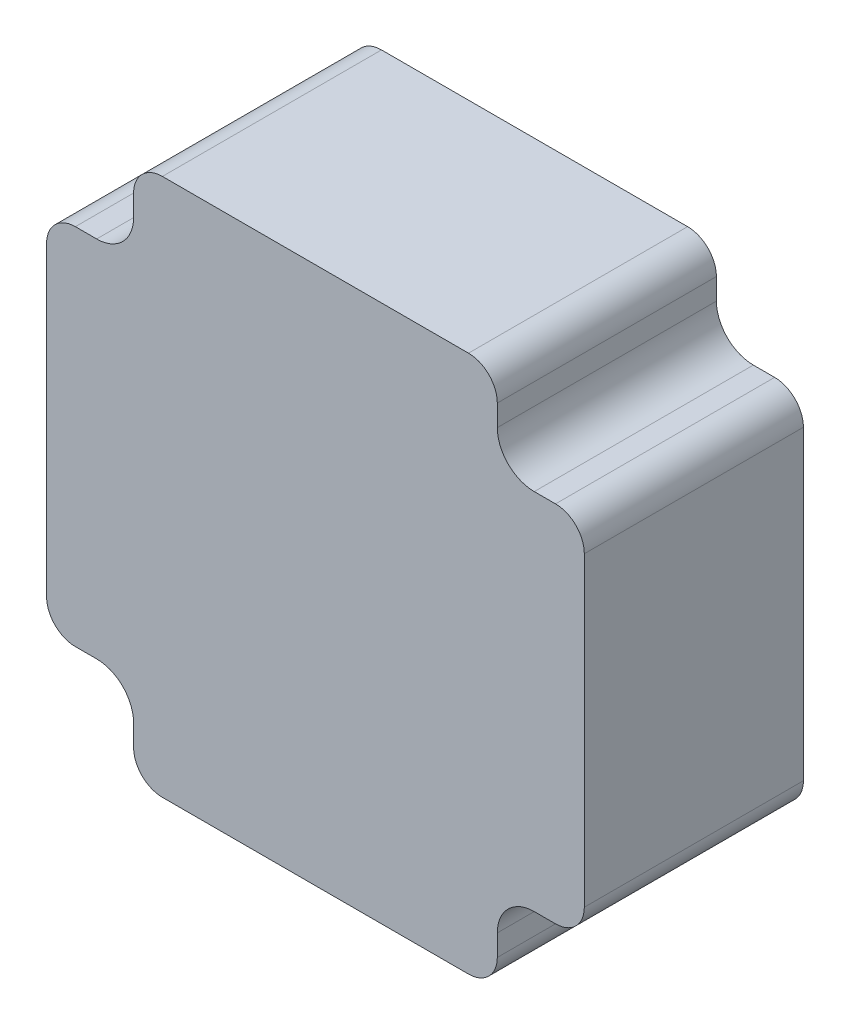
ISO-10303-21;
HEADER;
FILE_DESCRIPTION(('STEP AP214'),'2;1');
FILE_NAME('part.step','',(''),(''),'','','');
FILE_SCHEMA(('AUTOMOTIVE_DESIGN { 1 0 10303 214 1 1 1 1 }'));
ENDSEC;
DATA;
#1=APPLICATION_CONTEXT('core data for automotive mechanical design processes');
#2=APPLICATION_PROTOCOL_DEFINITION('international standard','automotive_design',2000,#1);
#3=PRODUCT_CONTEXT('',#1,'mechanical');
#4=PRODUCT('Part','Part','',(#3));
#5=PRODUCT_RELATED_PRODUCT_CATEGORY('part','',(#4));
#6=PRODUCT_DEFINITION_FORMATION('','',#4);
#7=PRODUCT_DEFINITION_CONTEXT('part definition',#1,'design');
#8=PRODUCT_DEFINITION('design','',#6,#7);
#9=PRODUCT_DEFINITION_SHAPE('','',#8);
#10=(LENGTH_UNIT() NAMED_UNIT(*) SI_UNIT(.MILLI.,.METRE.));
#11=(NAMED_UNIT(*) PLANE_ANGLE_UNIT() SI_UNIT($,.RADIAN.));
#12=(NAMED_UNIT(*) SI_UNIT($,.STERADIAN.) SOLID_ANGLE_UNIT());
#13=UNCERTAINTY_MEASURE_WITH_UNIT(LENGTH_MEASURE(1.E-05),#10,'distance_accuracy_value','');
#14=(GEOMETRIC_REPRESENTATION_CONTEXT(3) GLOBAL_UNCERTAINTY_ASSIGNED_CONTEXT((#13)) GLOBAL_UNIT_ASSIGNED_CONTEXT((#10,
#11,#12)) REPRESENTATION_CONTEXT('',''));
#15=CARTESIAN_POINT('',(0.,0.,0.));
#16=DIRECTION('',(0.,0.,1.));
#17=DIRECTION('',(1.,0.,0.));
#18=AXIS2_PLACEMENT_3D('',#15,#16,#17);
#19=CARTESIAN_POINT('',(38.3514690308085,-24.4516374316516,0.));
#20=DIRECTION('',(0.,0.,1.));
#21=DIRECTION('',(1.,0.,0.));
#22=AXIS2_PLACEMENT_3D('',#19,#20,#21);
#23=PLANE('',#22);
#24=CARTESIAN_POINT('',(38.3514690308085,-24.4516374316516,0.));
#25=DIRECTION('',(0.,0.,1.));
#26=DIRECTION('',(1.,0.,0.));
#27=AXIS2_PLACEMENT_3D('',#24,#25,#26);
#28=CIRCLE('',#27,4.6);
#29=CARTESIAN_POINT('',(38.3514690308085,-29.0516374316517,0.));
#30=VERTEX_POINT('',#29);
#31=CARTESIAN_POINT('',(42.9514690308084,-24.4516374316516,0.));
#32=VERTEX_POINT('',#31);
#33=EDGE_CURVE('E334',#30,#32,#28,.T.);
#34=ORIENTED_EDGE('',*,*,#33,.F.);
#35=DIRECTION('',(1.,0.,0.));
#36=VECTOR('',#35,1.);
#37=CARTESIAN_POINT('',(34.9514690308083,-29.0516374316517,0.));
#38=LINE('',#37,#36);
#39=CARTESIAN_POINT('',(34.9514690308083,-29.0516374316517,0.));
#40=VERTEX_POINT('',#39);
#41=EDGE_CURVE('E26',#40,#30,#38,.T.);
#42=ORIENTED_EDGE('',*,*,#41,.F.);
#43=CARTESIAN_POINT('',(34.9514690308075,-34.9516374316516,0.));
#44=DIRECTION('',(0.,0.,-1.));
#45=DIRECTION('',(1.,0.,0.));
#46=AXIS2_PLACEMENT_3D('',#43,#44,#45);
#47=CIRCLE('',#46,5.89999999999974);
#48=CARTESIAN_POINT('',(29.0514690308077,-34.9516374316516,0.));
#49=VERTEX_POINT('',#48);
#50=EDGE_CURVE('E128',#49,#40,#47,.T.);
#51=ORIENTED_EDGE('',*,*,#50,.F.);
#52=DIRECTION('',(0.,1.,0.));
#53=VECTOR('',#52,1.);
#54=CARTESIAN_POINT('',(29.0514690308079,-34.9516374316516,0.));
#55=LINE('',#54,#53);
#56=CARTESIAN_POINT('',(29.0514690308079,-38.3516374316512,0.));
#57=VERTEX_POINT('',#56);
#58=EDGE_CURVE('E131',#57,#49,#55,.T.);
#59=ORIENTED_EDGE('',*,*,#58,.F.);
#60=CARTESIAN_POINT('',(24.4514690308079,-38.3516374316512,0.));
#61=DIRECTION('',(0.,0.,1.));
#62=DIRECTION('',(1.,0.,0.));
#63=AXIS2_PLACEMENT_3D('',#60,#61,#62);
#64=CIRCLE('',#63,4.6);
#65=CARTESIAN_POINT('',(24.4514690308079,-42.9516374316512,0.));
#66=VERTEX_POINT('',#65);
#67=EDGE_CURVE('E167',#66,#57,#64,.T.);
#68=ORIENTED_EDGE('',*,*,#67,.F.);
#69=DIRECTION('',(1.,0.,0.));
#70=VECTOR('',#69,1.);
#71=CARTESIAN_POINT('',(24.4514690308079,-42.9516374316513,0.));
#72=LINE('',#71,#70);
#73=CARTESIAN_POINT('',(-24.4485309691918,-42.9516374316513,0.));
#74=VERTEX_POINT('',#73);
#75=EDGE_CURVE('E157',#74,#66,#72,.T.);
#76=ORIENTED_EDGE('',*,*,#75,.F.);
#77=CARTESIAN_POINT('',(-24.4485309691918,-38.3516374316514,0.));
#78=DIRECTION('',(0.,0.,1.));
#79=DIRECTION('',(1.,0.,0.));
#80=AXIS2_PLACEMENT_3D('',#77,#78,#79);
#81=CIRCLE('',#80,4.59999999999994);
#82=CARTESIAN_POINT('',(-29.0485309691917,-38.3516374316514,0.));
#83=VERTEX_POINT('',#82);
#84=EDGE_CURVE('E210',#83,#74,#81,.T.);
#85=ORIENTED_EDGE('',*,*,#84,.F.);
#86=DIRECTION('',(0.,-1.,0.));
#87=VECTOR('',#86,1.);
#88=CARTESIAN_POINT('',(-29.0485309691917,-34.9516374316513,0.));
#89=LINE('',#88,#87);
#90=CARTESIAN_POINT('',(-29.0485309691917,-34.9516374316513,0.));
#91=VERTEX_POINT('',#90);
#92=EDGE_CURVE('E201',#91,#83,#89,.T.);
#93=ORIENTED_EDGE('',*,*,#92,.F.);
#94=CARTESIAN_POINT('',(-34.9485309691912,-34.9516374316512,0.));
#95=DIRECTION('',(0.,0.,-1.));
#96=DIRECTION('',(1.,0.,0.));
#97=AXIS2_PLACEMENT_3D('',#94,#95,#96);
#98=CIRCLE('',#97,5.89999999999954);
#99=CARTESIAN_POINT('',(-34.9485309691912,-29.0516374316516,0.));
#100=VERTEX_POINT('',#99);
#101=EDGE_CURVE('E197',#100,#91,#98,.T.);
#102=ORIENTED_EDGE('',*,*,#101,.F.);
#103=DIRECTION('',(1.,0.,0.));
#104=VECTOR('',#103,1.);
#105=CARTESIAN_POINT('',(-34.9485309691912,-29.0516374316517,0.));
#106=LINE('',#105,#104);
#107=CARTESIAN_POINT('',(-38.3485309691922,-29.0516374316517,0.));
#108=VERTEX_POINT('',#107);
#109=EDGE_CURVE('E184',#108,#100,#106,.T.);
#110=ORIENTED_EDGE('',*,*,#109,.F.);
#111=CARTESIAN_POINT('',(-38.3485309691922,-24.4516374316518,0.));
#112=DIRECTION('',(0.,0.,1.));
#113=DIRECTION('',(1.,0.,0.));
#114=AXIS2_PLACEMENT_3D('',#111,#112,#113);
#115=CIRCLE('',#114,4.59999999999994);
#116=CARTESIAN_POINT('',(-42.9485309691921,-24.4516374316513,0.));
#117=VERTEX_POINT('',#116);
#118=EDGE_CURVE('E523',#117,#108,#115,.T.);
#119=ORIENTED_EDGE('',*,*,#118,.F.);
#120=DIRECTION('',(0.,-1.,0.));
#121=VECTOR('',#120,1.);
#122=CARTESIAN_POINT('',(-42.9485309691921,-0.0016374316514911,0.));
#123=LINE('',#122,#121);
#124=CARTESIAN_POINT('',(-42.9485309691921,24.4483625683486,0.));
#125=VERTEX_POINT('',#124);
#126=EDGE_CURVE('E418',#125,#117,#123,.T.);
#127=ORIENTED_EDGE('',*,*,#126,.F.);
#128=CARTESIAN_POINT('',(-38.3485309691922,24.4483625683486,0.));
#129=DIRECTION('',(0.,0.,1.));
#130=DIRECTION('',(1.,0.,0.));
#131=AXIS2_PLACEMENT_3D('',#128,#129,#130);
#132=CIRCLE('',#131,4.59999999999977);
#133=CARTESIAN_POINT('',(-38.3485309691932,29.0483625683484,0.));
#134=VERTEX_POINT('',#133);
#135=EDGE_CURVE('E385',#134,#125,#132,.T.);
#136=ORIENTED_EDGE('',*,*,#135,.F.);
#137=DIRECTION('',(-1.,0.,0.));
#138=VECTOR('',#137,1.);
#139=CARTESIAN_POINT('',(-34.9485309691932,29.0483625683483,0.));
#140=LINE('',#139,#138);
#141=CARTESIAN_POINT('',(-34.9485309691932,29.0483625683483,0.));
#142=VERTEX_POINT('',#141);
#143=EDGE_CURVE('E503',#142,#134,#140,.T.);
#144=ORIENTED_EDGE('',*,*,#143,.F.);
#145=CARTESIAN_POINT('',(-34.9485309691922,34.948362568348,0.));
#146=DIRECTION('',(0.,0.,-1.));
#147=DIRECTION('',(1.,0.,0.));
#148=AXIS2_PLACEMENT_3D('',#145,#146,#147);
#149=CIRCLE('',#148,5.89999999999974);
#150=CARTESIAN_POINT('',(-29.0485309691925,34.9483625683476,0.));
#151=VERTEX_POINT('',#150);
#152=EDGE_CURVE('E397',#151,#142,#149,.T.);
#153=ORIENTED_EDGE('',*,*,#152,.F.);
#154=DIRECTION('',(-2.44902137784916E-13,-1.,0.));
#155=VECTOR('',#154,1.);
#156=CARTESIAN_POINT('',(-29.0485309691925,34.9483625683476,0.));
#157=LINE('',#156,#155);
#158=CARTESIAN_POINT('',(-29.0485309691917,38.3483625683483,0.));
#159=VERTEX_POINT('',#158);
#160=EDGE_CURVE('E405',#159,#151,#157,.T.);
#161=ORIENTED_EDGE('',*,*,#160,.F.);
#162=CARTESIAN_POINT('',(-24.4485309691925,38.3483625683483,0.));
#163=DIRECTION('',(0.,0.,1.));
#164=DIRECTION('',(1.,0.,0.));
#165=AXIS2_PLACEMENT_3D('',#162,#163,#164);
#166=CIRCLE('',#165,4.59999999999963);
#167=CARTESIAN_POINT('',(-24.4485309691967,42.9483625683479,0.));
#168=VERTEX_POINT('',#167);
#169=EDGE_CURVE('E371',#168,#159,#166,.T.);
#170=ORIENTED_EDGE('',*,*,#169,.F.);
#171=DIRECTION('',(-1.,0.,0.));
#172=VECTOR('',#171,1.);
#173=CARTESIAN_POINT('',(0.00146903080405769,42.9483625683483,0.));
#174=LINE('',#173,#172);
#175=CARTESIAN_POINT('',(24.4514690308031,42.9483625683483,0.));
#176=VERTEX_POINT('',#175);
#177=EDGE_CURVE('E377',#176,#168,#174,.T.);
#178=ORIENTED_EDGE('',*,*,#177,.F.);
#179=CARTESIAN_POINT('',(24.4514690308031,38.3483625683475,0.));
#180=DIRECTION('',(0.,0.,1.));
#181=DIRECTION('',(1.,0.,0.));
#182=AXIS2_PLACEMENT_3D('',#179,#180,#181);
#183=CIRCLE('',#182,4.60000000000083);
#184=CARTESIAN_POINT('',(29.0514690308038,38.3483625683484,0.));
#185=VERTEX_POINT('',#184);
#186=EDGE_CURVE('E459',#185,#176,#183,.T.);
#187=ORIENTED_EDGE('',*,*,#186,.F.);
#188=DIRECTION('',(0.,1.,0.));
#189=VECTOR('',#188,1.);
#190=CARTESIAN_POINT('',(29.0514690308038,34.9483625683484,0.));
#191=LINE('',#190,#189);
#192=CARTESIAN_POINT('',(29.0514690308038,34.9483625683484,0.));
#193=VERTEX_POINT('',#192);
#194=EDGE_CURVE('E359',#193,#185,#191,.T.);
#195=ORIENTED_EDGE('',*,*,#194,.F.);
#196=CARTESIAN_POINT('',(34.9514690308034,34.9483625683478,0.));
#197=DIRECTION('',(0.,0.,-1.));
#198=DIRECTION('',(1.,0.,0.));
#199=AXIS2_PLACEMENT_3D('',#196,#197,#198);
#200=CIRCLE('',#199,5.89999999999954);
#201=CARTESIAN_POINT('',(34.9514690308034,29.0483625683483,0.));
#202=VERTEX_POINT('',#201);
#203=EDGE_CURVE('E414',#202,#193,#200,.T.);
#204=ORIENTED_EDGE('',*,*,#203,.F.);
#205=DIRECTION('',(-1.,0.,0.));
#206=VECTOR('',#205,1.);
#207=CARTESIAN_POINT('',(34.9514690308034,29.0483625683483,0.));
#208=LINE('',#207,#206);
#209=CARTESIAN_POINT('',(38.3514690308047,29.0483625683483,0.));
#210=VERTEX_POINT('',#209);
#211=EDGE_CURVE('E365',#210,#202,#208,.T.);
#212=ORIENTED_EDGE('',*,*,#211,.F.);
#213=CARTESIAN_POINT('',(38.3514690308076,24.4483625683479,0.));
#214=DIRECTION('',(0.,0.,1.));
#215=DIRECTION('',(1.,0.,0.));
#216=AXIS2_PLACEMENT_3D('',#213,#214,#215);
#217=CIRCLE('',#216,4.60000000000059);
#218=CARTESIAN_POINT('',(42.9514690308081,24.4483625683483,0.));
#219=VERTEX_POINT('',#218);
#220=EDGE_CURVE('E383',#219,#210,#217,.T.);
#221=ORIENTED_EDGE('',*,*,#220,.F.);
#222=DIRECTION('',(0.,1.,0.));
#223=VECTOR('',#222,1.);
#224=CARTESIAN_POINT('',(42.9514690308084,-0.0016374316514911,0.));
#225=LINE('',#224,#223);
#226=EDGE_CURVE('E401',#32,#219,#225,.T.);
#227=ORIENTED_EDGE('',*,*,#226,.F.);
#228=EDGE_LOOP('',(#34,#42,#51,#59,#68,#76,#85,#93,#102,#110,#119,#127,#136,#144,#153,#161,#170,
#178,#187,#195,#204,#212,#221,#227));
#229=FACE_BOUND('',#228,.T.);
#230=ADVANCED_FACE('F17',(#229),#23,.F.);
#231=CARTESIAN_POINT('',(38.3514690308085,-24.4516374316516,35.));
#232=DIRECTION('',(0.,0.,1.));
#233=DIRECTION('',(1.,0.,0.));
#234=AXIS2_PLACEMENT_3D('',#231,#232,#233);
#235=PLANE('',#234);
#236=CARTESIAN_POINT('',(38.3514690308085,-24.4516374316516,35.));
#237=DIRECTION('',(0.,0.,1.));
#238=DIRECTION('',(1.,0.,0.));
#239=AXIS2_PLACEMENT_3D('',#236,#237,#238);
#240=CIRCLE('',#239,4.6);
#241=CARTESIAN_POINT('',(38.3514690308085,-29.0516374316517,35.));
#242=VERTEX_POINT('',#241);
#243=CARTESIAN_POINT('',(42.9514690308084,-24.4516374316516,35.));
#244=VERTEX_POINT('',#243);
#245=EDGE_CURVE('E351',#242,#244,#240,.T.);
#246=ORIENTED_EDGE('',*,*,#245,.T.);
#247=DIRECTION('',(0.,1.,0.));
#248=VECTOR('',#247,1.);
#249=CARTESIAN_POINT('',(42.9514690308084,-0.0016374316514911,35.));
#250=LINE('',#249,#248);
#251=CARTESIAN_POINT('',(42.9514690308081,24.4483625683483,35.));
#252=VERTEX_POINT('',#251);
#253=EDGE_CURVE('E379',#244,#252,#250,.T.);
#254=ORIENTED_EDGE('',*,*,#253,.T.);
#255=CARTESIAN_POINT('',(38.3514690308076,24.4483625683479,35.));
#256=DIRECTION('',(0.,0.,1.));
#257=DIRECTION('',(1.,0.,0.));
#258=AXIS2_PLACEMENT_3D('',#255,#256,#257);
#259=CIRCLE('',#258,4.60000000000059);
#260=CARTESIAN_POINT('',(38.3514690308047,29.0483625683483,35.));
#261=VERTEX_POINT('',#260);
#262=EDGE_CURVE('E361',#252,#261,#259,.T.);
#263=ORIENTED_EDGE('',*,*,#262,.T.);
#264=DIRECTION('',(-1.,0.,0.));
#265=VECTOR('',#264,1.);
#266=CARTESIAN_POINT('',(34.9514690308034,29.0483625683483,35.));
#267=LINE('',#266,#265);
#268=CARTESIAN_POINT('',(34.9514690308034,29.0483625683483,35.));
#269=VERTEX_POINT('',#268);
#270=EDGE_CURVE('E355',#261,#269,#267,.T.);
#271=ORIENTED_EDGE('',*,*,#270,.T.);
#272=CARTESIAN_POINT('',(34.9514690308034,34.9483625683478,35.));
#273=DIRECTION('',(0.,0.,-1.));
#274=DIRECTION('',(1.,0.,0.));
#275=AXIS2_PLACEMENT_3D('',#272,#273,#274);
#276=CIRCLE('',#275,5.89999999999954);
#277=CARTESIAN_POINT('',(29.0514690308038,34.9483625683484,35.));
#278=VERTEX_POINT('',#277);
#279=EDGE_CURVE('E356',#269,#278,#276,.T.);
#280=ORIENTED_EDGE('',*,*,#279,.T.);
#281=DIRECTION('',(0.,1.,0.));
#282=VECTOR('',#281,1.);
#283=CARTESIAN_POINT('',(29.0514690308038,34.9483625683484,35.));
#284=LINE('',#283,#282);
#285=CARTESIAN_POINT('',(29.0514690308038,38.3483625683484,35.));
#286=VERTEX_POINT('',#285);
#287=EDGE_CURVE('E455',#278,#286,#284,.T.);
#288=ORIENTED_EDGE('',*,*,#287,.T.);
#289=CARTESIAN_POINT('',(24.4514690308031,38.3483625683475,35.));
#290=DIRECTION('',(0.,0.,1.));
#291=DIRECTION('',(1.,0.,0.));
#292=AXIS2_PLACEMENT_3D('',#289,#290,#291);
#293=CIRCLE('',#292,4.60000000000083);
#294=CARTESIAN_POINT('',(24.4514690308031,42.9483625683483,35.));
#295=VERTEX_POINT('',#294);
#296=EDGE_CURVE('E373',#286,#295,#293,.T.);
#297=ORIENTED_EDGE('',*,*,#296,.T.);
#298=DIRECTION('',(-1.,0.,0.));
#299=VECTOR('',#298,1.);
#300=CARTESIAN_POINT('',(0.00146903080405769,42.9483625683483,35.));
#301=LINE('',#300,#299);
#302=CARTESIAN_POINT('',(-24.4485309691967,42.9483625683479,35.));
#303=VERTEX_POINT('',#302);
#304=EDGE_CURVE('E472',#295,#303,#301,.T.);
#305=ORIENTED_EDGE('',*,*,#304,.T.);
#306=CARTESIAN_POINT('',(-24.4485309691925,38.3483625683483,35.));
#307=DIRECTION('',(0.,0.,1.));
#308=DIRECTION('',(1.,0.,0.));
#309=AXIS2_PLACEMENT_3D('',#306,#307,#308);
#310=CIRCLE('',#309,4.59999999999963);
#311=CARTESIAN_POINT('',(-29.0485309691917,38.3483625683483,35.));
#312=VERTEX_POINT('',#311);
#313=EDGE_CURVE('E370',#303,#312,#310,.T.);
#314=ORIENTED_EDGE('',*,*,#313,.T.);
#315=DIRECTION('',(-2.44902137784916E-13,-1.,0.));
#316=VECTOR('',#315,1.);
#317=CARTESIAN_POINT('',(-29.0485309691925,34.9483625683476,35.));
#318=LINE('',#317,#316);
#319=CARTESIAN_POINT('',(-29.0485309691925,34.9483625683476,35.));
#320=VERTEX_POINT('',#319);
#321=EDGE_CURVE('E393',#312,#320,#318,.T.);
#322=ORIENTED_EDGE('',*,*,#321,.T.);
#323=CARTESIAN_POINT('',(-34.9485309691922,34.948362568348,35.));
#324=DIRECTION('',(0.,0.,-1.));
#325=DIRECTION('',(1.,0.,0.));
#326=AXIS2_PLACEMENT_3D('',#323,#324,#325);
#327=CIRCLE('',#326,5.89999999999974);
#328=CARTESIAN_POINT('',(-34.9485309691932,29.0483625683483,35.));
#329=VERTEX_POINT('',#328);
#330=EDGE_CURVE('E499',#320,#329,#327,.T.);
#331=ORIENTED_EDGE('',*,*,#330,.T.);
#332=DIRECTION('',(-1.,0.,0.));
#333=VECTOR('',#332,1.);
#334=CARTESIAN_POINT('',(-34.9485309691932,29.0483625683483,35.));
#335=LINE('',#334,#333);
#336=CARTESIAN_POINT('',(-38.3485309691932,29.0483625683484,35.));
#337=VERTEX_POINT('',#336);
#338=EDGE_CURVE('E390',#329,#337,#335,.T.);
#339=ORIENTED_EDGE('',*,*,#338,.T.);
#340=CARTESIAN_POINT('',(-38.3485309691922,24.4483625683486,35.));
#341=DIRECTION('',(0.,0.,1.));
#342=DIRECTION('',(1.,0.,0.));
#343=AXIS2_PLACEMENT_3D('',#340,#341,#342);
#344=CIRCLE('',#343,4.59999999999977);
#345=CARTESIAN_POINT('',(-42.9485309691921,24.4483625683486,35.));
#346=VERTEX_POINT('',#345);
#347=EDGE_CURVE('E423',#337,#346,#344,.T.);
#348=ORIENTED_EDGE('',*,*,#347,.T.);
#349=DIRECTION('',(0.,-1.,0.));
#350=VECTOR('',#349,1.);
#351=CARTESIAN_POINT('',(-42.9485309691921,-0.0016374316514911,35.));
#352=LINE('',#351,#350);
#353=CARTESIAN_POINT('',(-42.9485309691921,-24.4516374316513,35.));
#354=VERTEX_POINT('',#353);
#355=EDGE_CURVE('E519',#346,#354,#352,.T.);
#356=ORIENTED_EDGE('',*,*,#355,.T.);
#357=CARTESIAN_POINT('',(-38.3485309691922,-24.4516374316518,35.));
#358=DIRECTION('',(0.,0.,1.));
#359=DIRECTION('',(1.,0.,0.));
#360=AXIS2_PLACEMENT_3D('',#357,#358,#359);
#361=CIRCLE('',#360,4.59999999999994);
#362=CARTESIAN_POINT('',(-38.3485309691922,-29.0516374316517,35.));
#363=VERTEX_POINT('',#362);
#364=EDGE_CURVE('E182',#354,#363,#361,.T.);
#365=ORIENTED_EDGE('',*,*,#364,.T.);
#366=DIRECTION('',(1.,0.,0.));
#367=VECTOR('',#366,1.);
#368=CARTESIAN_POINT('',(-34.9485309691912,-29.0516374316517,35.));
#369=LINE('',#368,#367);
#370=CARTESIAN_POINT('',(-34.9485309691912,-29.0516374316516,35.));
#371=VERTEX_POINT('',#370);
#372=EDGE_CURVE('E191',#363,#371,#369,.T.);
#373=ORIENTED_EDGE('',*,*,#372,.T.);
#374=CARTESIAN_POINT('',(-34.9485309691912,-34.9516374316512,35.));
#375=DIRECTION('',(0.,0.,-1.));
#376=DIRECTION('',(1.,0.,0.));
#377=AXIS2_PLACEMENT_3D('',#374,#375,#376);
#378=CIRCLE('',#377,5.89999999999954);
#379=CARTESIAN_POINT('',(-29.0485309691917,-34.9516374316513,35.));
#380=VERTEX_POINT('',#379);
#381=EDGE_CURVE('E196',#371,#380,#378,.T.);
#382=ORIENTED_EDGE('',*,*,#381,.T.);
#383=DIRECTION('',(0.,-1.,0.));
#384=VECTOR('',#383,1.);
#385=CARTESIAN_POINT('',(-29.0485309691917,-34.9516374316513,35.));
#386=LINE('',#385,#384);
#387=CARTESIAN_POINT('',(-29.0485309691917,-38.3516374316514,35.));
#388=VERTEX_POINT('',#387);
#389=EDGE_CURVE('E206',#380,#388,#386,.T.);
#390=ORIENTED_EDGE('',*,*,#389,.T.);
#391=CARTESIAN_POINT('',(-24.4485309691918,-38.3516374316514,35.));
#392=DIRECTION('',(0.,0.,1.));
#393=DIRECTION('',(1.,0.,0.));
#394=AXIS2_PLACEMENT_3D('',#391,#392,#393);
#395=CIRCLE('',#394,4.59999999999994);
#396=CARTESIAN_POINT('',(-24.4485309691918,-42.9516374316513,35.));
#397=VERTEX_POINT('',#396);
#398=EDGE_CURVE('E155',#388,#397,#395,.T.);
#399=ORIENTED_EDGE('',*,*,#398,.T.);
#400=DIRECTION('',(1.,0.,0.));
#401=VECTOR('',#400,1.);
#402=CARTESIAN_POINT('',(24.4514690308079,-42.9516374316513,35.));
#403=LINE('',#402,#401);
#404=CARTESIAN_POINT('',(24.4514690308079,-42.9516374316512,35.));
#405=VERTEX_POINT('',#404);
#406=EDGE_CURVE('E140',#397,#405,#403,.T.);
#407=ORIENTED_EDGE('',*,*,#406,.T.);
#408=CARTESIAN_POINT('',(24.4514690308079,-38.3516374316512,35.));
#409=DIRECTION('',(0.,0.,1.));
#410=DIRECTION('',(1.,0.,0.));
#411=AXIS2_PLACEMENT_3D('',#408,#409,#410);
#412=CIRCLE('',#411,4.6);
#413=CARTESIAN_POINT('',(29.0514690308079,-38.3516374316512,35.));
#414=VERTEX_POINT('',#413);
#415=EDGE_CURVE('E123',#405,#414,#412,.T.);
#416=ORIENTED_EDGE('',*,*,#415,.T.);
#417=DIRECTION('',(0.,1.,0.));
#418=VECTOR('',#417,1.);
#419=CARTESIAN_POINT('',(29.0514690308079,-34.9516374316516,35.));
#420=LINE('',#419,#418);
#421=CARTESIAN_POINT('',(29.0514690308077,-34.9516374316516,35.));
#422=VERTEX_POINT('',#421);
#423=EDGE_CURVE('E119',#414,#422,#420,.T.);
#424=ORIENTED_EDGE('',*,*,#423,.T.);
#425=CARTESIAN_POINT('',(34.9514690308075,-34.9516374316516,35.));
#426=DIRECTION('',(0.,0.,-1.));
#427=DIRECTION('',(1.,0.,0.));
#428=AXIS2_PLACEMENT_3D('',#425,#426,#427);
#429=CIRCLE('',#428,5.89999999999974);
#430=CARTESIAN_POINT('',(34.9514690308083,-29.0516374316517,35.));
#431=VERTEX_POINT('',#430);
#432=EDGE_CURVE('E108',#422,#431,#429,.T.);
#433=ORIENTED_EDGE('',*,*,#432,.T.);
#434=DIRECTION('',(1.,0.,0.));
#435=VECTOR('',#434,1.);
#436=CARTESIAN_POINT('',(34.9514690308083,-29.0516374316517,35.));
#437=LINE('',#436,#435);
#438=EDGE_CURVE('E11',#431,#242,#437,.T.);
#439=ORIENTED_EDGE('',*,*,#438,.T.);
#440=EDGE_LOOP('',(#246,#254,#263,#271,#280,#288,#297,#305,#314,#322,#331,#339,#348,#356,#365,
#373,#382,#390,#399,#407,#416,#424,#433,#439));
#441=FACE_BOUND('',#440,.T.);
#442=ADVANCED_FACE('F121',(#441),#235,.T.);
#443=CARTESIAN_POINT('',(34.9514690308083,-29.0516374316517,35.));
#444=DIRECTION('',(0.,1.,0.));
#445=DIRECTION('',(1.,0.,0.));
#446=AXIS2_PLACEMENT_3D('',#443,#444,#445);
#447=PLANE('',#446);
#448=ORIENTED_EDGE('',*,*,#41,.T.);
#449=DIRECTION('',(0.,0.,-1.));
#450=VECTOR('',#449,1.);
#451=CARTESIAN_POINT('',(38.3514690308085,-29.0516374316517,35.));
#452=LINE('',#451,#450);
#453=EDGE_CURVE('E340',#242,#30,#452,.T.);
#454=ORIENTED_EDGE('',*,*,#453,.F.);
#455=ORIENTED_EDGE('',*,*,#438,.F.);
#456=DIRECTION('',(0.,0.,-1.));
#457=VECTOR('',#456,1.);
#458=CARTESIAN_POINT('',(34.9514690308083,-29.0516374316517,35.));
#459=LINE('',#458,#457);
#460=EDGE_CURVE('E115',#431,#40,#459,.T.);
#461=ORIENTED_EDGE('',*,*,#460,.T.);
#462=EDGE_LOOP('',(#448,#454,#455,#461));
#463=FACE_BOUND('',#462,.T.);
#464=ADVANCED_FACE('F245',(#463),#447,.F.);
#465=CARTESIAN_POINT('',(34.9514690308075,-34.9516374316516,35.));
#466=DIRECTION('',(0.,0.,-1.));
#467=DIRECTION('',(-1.,0.,0.));
#468=AXIS2_PLACEMENT_3D('',#465,#466,#467);
#469=CYLINDRICAL_SURFACE('',#468,5.89999999999974);
#470=ORIENTED_EDGE('',*,*,#50,.T.);
#471=ORIENTED_EDGE('',*,*,#460,.F.);
#472=ORIENTED_EDGE('',*,*,#432,.F.);
#473=DIRECTION('',(0.,0.,-1.));
#474=VECTOR('',#473,1.);
#475=CARTESIAN_POINT('',(29.0514690308077,-34.9516374316516,35.));
#476=LINE('',#475,#474);
#477=EDGE_CURVE('E113',#422,#49,#476,.T.);
#478=ORIENTED_EDGE('',*,*,#477,.T.);
#479=EDGE_LOOP('',(#470,#471,#472,#478));
#480=FACE_BOUND('',#479,.T.);
#481=ADVANCED_FACE('F111',(#480),#469,.F.);
#482=CARTESIAN_POINT('',(29.0514690308079,-34.9516374316516,35.));
#483=DIRECTION('',(-1.,0.,0.));
#484=DIRECTION('',(0.,0.,1.));
#485=AXIS2_PLACEMENT_3D('',#482,#483,#484);
#486=PLANE('',#485);
#487=ORIENTED_EDGE('',*,*,#58,.T.);
#488=ORIENTED_EDGE('',*,*,#477,.F.);
#489=ORIENTED_EDGE('',*,*,#423,.F.);
#490=DIRECTION('',(0.,0.,-1.));
#491=VECTOR('',#490,1.);
#492=CARTESIAN_POINT('',(29.0514690308079,-38.3516374316512,35.));
#493=LINE('',#492,#491);
#494=EDGE_CURVE('E172',#414,#57,#493,.T.);
#495=ORIENTED_EDGE('',*,*,#494,.T.);
#496=EDGE_LOOP('',(#487,#488,#489,#495));
#497=FACE_BOUND('',#496,.T.);
#498=ADVANCED_FACE('F130',(#497),#486,.F.);
#499=CARTESIAN_POINT('',(24.4514690308079,-38.3516374316512,35.));
#500=DIRECTION('',(0.,0.,-1.));
#501=DIRECTION('',(-1.,0.,0.));
#502=AXIS2_PLACEMENT_3D('',#499,#500,#501);
#503=CYLINDRICAL_SURFACE('',#502,4.6);
#504=ORIENTED_EDGE('',*,*,#67,.T.);
#505=ORIENTED_EDGE('',*,*,#494,.F.);
#506=ORIENTED_EDGE('',*,*,#415,.F.);
#507=DIRECTION('',(0.,0.,-1.));
#508=VECTOR('',#507,1.);
#509=CARTESIAN_POINT('',(24.4514690308079,-42.9516374316512,35.));
#510=LINE('',#509,#508);
#511=EDGE_CURVE('E159',#405,#66,#510,.T.);
#512=ORIENTED_EDGE('',*,*,#511,.T.);
#513=EDGE_LOOP('',(#504,#505,#506,#512));
#514=FACE_BOUND('',#513,.T.);
#515=ADVANCED_FACE('F230',(#514),#503,.T.);
#516=CARTESIAN_POINT('',(24.4514690308079,-42.9516374316513,35.));
#517=DIRECTION('',(0.,1.,0.));
#518=DIRECTION('',(1.,0.,0.));
#519=AXIS2_PLACEMENT_3D('',#516,#517,#518);
#520=PLANE('',#519);
#521=ORIENTED_EDGE('',*,*,#75,.T.);
#522=ORIENTED_EDGE('',*,*,#511,.F.);
#523=ORIENTED_EDGE('',*,*,#406,.F.);
#524=DIRECTION('',(0.,0.,-1.));
#525=VECTOR('',#524,1.);
#526=CARTESIAN_POINT('',(-24.4485309691918,-42.9516374316513,35.));
#527=LINE('',#526,#525);
#528=EDGE_CURVE('E213',#397,#74,#527,.T.);
#529=ORIENTED_EDGE('',*,*,#528,.T.);
#530=EDGE_LOOP('',(#521,#522,#523,#529));
#531=FACE_BOUND('',#530,.T.);
#532=ADVANCED_FACE('F228',(#531),#520,.F.);
#533=CARTESIAN_POINT('',(-24.4485309691918,-38.3516374316514,35.));
#534=DIRECTION('',(0.,0.,-1.));
#535=DIRECTION('',(-1.,0.,0.));
#536=AXIS2_PLACEMENT_3D('',#533,#534,#535);
#537=CYLINDRICAL_SURFACE('',#536,4.59999999999994);
#538=ORIENTED_EDGE('',*,*,#84,.T.);
#539=ORIENTED_EDGE('',*,*,#528,.F.);
#540=ORIENTED_EDGE('',*,*,#398,.F.);
#541=DIRECTION('',(0.,0.,-1.));
#542=VECTOR('',#541,1.);
#543=CARTESIAN_POINT('',(-29.0485309691917,-38.3516374316514,35.));
#544=LINE('',#543,#542);
#545=EDGE_CURVE('E205',#388,#83,#544,.T.);
#546=ORIENTED_EDGE('',*,*,#545,.T.);
#547=EDGE_LOOP('',(#538,#539,#540,#546));
#548=FACE_BOUND('',#547,.T.);
#549=ADVANCED_FACE('F225',(#548),#537,.T.);
#550=CARTESIAN_POINT('',(-29.0485309691917,-34.9516374316513,35.));
#551=DIRECTION('',(1.,0.,0.));
#552=DIRECTION('',(0.,1.,0.));
#553=AXIS2_PLACEMENT_3D('',#550,#551,#552);
#554=PLANE('',#553);
#555=ORIENTED_EDGE('',*,*,#92,.T.);
#556=ORIENTED_EDGE('',*,*,#545,.F.);
#557=ORIENTED_EDGE('',*,*,#389,.F.);
#558=DIRECTION('',(0.,0.,-1.));
#559=VECTOR('',#558,1.);
#560=CARTESIAN_POINT('',(-29.0485309691917,-34.9516374316513,35.));
#561=LINE('',#560,#559);
#562=EDGE_CURVE('E192',#380,#91,#561,.T.);
#563=ORIENTED_EDGE('',*,*,#562,.T.);
#564=EDGE_LOOP('',(#555,#556,#557,#563));
#565=FACE_BOUND('',#564,.T.);
#566=ADVANCED_FACE('F237',(#565),#554,.F.);
#567=CARTESIAN_POINT('',(-34.9485309691912,-34.9516374316512,35.));
#568=DIRECTION('',(0.,0.,-1.));
#569=DIRECTION('',(-1.,0.,0.));
#570=AXIS2_PLACEMENT_3D('',#567,#568,#569);
#571=CYLINDRICAL_SURFACE('',#570,5.89999999999954);
#572=ORIENTED_EDGE('',*,*,#101,.T.);
#573=ORIENTED_EDGE('',*,*,#562,.F.);
#574=ORIENTED_EDGE('',*,*,#381,.F.);
#575=DIRECTION('',(0.,0.,-1.));
#576=VECTOR('',#575,1.);
#577=CARTESIAN_POINT('',(-34.9485309691912,-29.0516374316516,35.));
#578=LINE('',#577,#576);
#579=EDGE_CURVE('E187',#371,#100,#578,.T.);
#580=ORIENTED_EDGE('',*,*,#579,.T.);
#581=EDGE_LOOP('',(#572,#573,#574,#580));
#582=FACE_BOUND('',#581,.T.);
#583=ADVANCED_FACE('F258',(#582),#571,.F.);
#584=CARTESIAN_POINT('',(-34.9485309691912,-29.0516374316517,35.));
#585=DIRECTION('',(0.,1.,0.));
#586=DIRECTION('',(1.,0.,0.));
#587=AXIS2_PLACEMENT_3D('',#584,#585,#586);
#588=PLANE('',#587);
#589=ORIENTED_EDGE('',*,*,#109,.T.);
#590=ORIENTED_EDGE('',*,*,#579,.F.);
#591=ORIENTED_EDGE('',*,*,#372,.F.);
#592=DIRECTION('',(0.,0.,-1.));
#593=VECTOR('',#592,1.);
#594=CARTESIAN_POINT('',(-38.3485309691922,-29.0516374316517,35.));
#595=LINE('',#594,#593);
#596=EDGE_CURVE('E526',#363,#108,#595,.T.);
#597=ORIENTED_EDGE('',*,*,#596,.T.);
#598=EDGE_LOOP('',(#589,#590,#591,#597));
#599=FACE_BOUND('',#598,.T.);
#600=ADVANCED_FACE('F261',(#599),#588,.F.);
#601=CARTESIAN_POINT('',(-38.3485309691922,-24.4516374316518,35.));
#602=DIRECTION('',(0.,0.,-1.));
#603=DIRECTION('',(-1.,0.,0.));
#604=AXIS2_PLACEMENT_3D('',#601,#602,#603);
#605=CYLINDRICAL_SURFACE('',#604,4.59999999999994);
#606=ORIENTED_EDGE('',*,*,#118,.T.);
#607=ORIENTED_EDGE('',*,*,#596,.F.);
#608=ORIENTED_EDGE('',*,*,#364,.F.);
#609=DIRECTION('',(0.,0.,-1.));
#610=VECTOR('',#609,1.);
#611=CARTESIAN_POINT('',(-42.9485309691921,-24.4516374316513,35.));
#612=LINE('',#611,#610);
#613=EDGE_CURVE('E422',#354,#117,#612,.T.);
#614=ORIENTED_EDGE('',*,*,#613,.T.);
#615=EDGE_LOOP('',(#606,#607,#608,#614));
#616=FACE_BOUND('',#615,.T.);
#617=ADVANCED_FACE('F263',(#616),#605,.T.);
#618=CARTESIAN_POINT('',(-42.9485309691921,-0.0016374316514911,35.));
#619=DIRECTION('',(1.,0.,0.));
#620=DIRECTION('',(0.,1.,0.));
#621=AXIS2_PLACEMENT_3D('',#618,#619,#620);
#622=PLANE('',#621);
#623=ORIENTED_EDGE('',*,*,#126,.T.);
#624=ORIENTED_EDGE('',*,*,#613,.F.);
#625=ORIENTED_EDGE('',*,*,#355,.F.);
#626=DIRECTION('',(0.,0.,-1.));
#627=VECTOR('',#626,1.);
#628=CARTESIAN_POINT('',(-42.9485309691921,24.4483625683486,35.));
#629=LINE('',#628,#627);
#630=EDGE_CURVE('E389',#346,#125,#629,.T.);
#631=ORIENTED_EDGE('',*,*,#630,.T.);
#632=EDGE_LOOP('',(#623,#624,#625,#631));
#633=FACE_BOUND('',#632,.T.);
#634=ADVANCED_FACE('F266',(#633),#622,.F.);
#635=CARTESIAN_POINT('',(-38.3485309691922,24.4483625683486,35.));
#636=DIRECTION('',(0.,0.,-1.));
#637=DIRECTION('',(-1.,0.,0.));
#638=AXIS2_PLACEMENT_3D('',#635,#636,#637);
#639=CYLINDRICAL_SURFACE('',#638,4.59999999999977);
#640=ORIENTED_EDGE('',*,*,#135,.T.);
#641=ORIENTED_EDGE('',*,*,#630,.F.);
#642=ORIENTED_EDGE('',*,*,#347,.F.);
#643=DIRECTION('',(0.,0.,-1.));
#644=VECTOR('',#643,1.);
#645=CARTESIAN_POINT('',(-38.3485309691932,29.0483625683484,35.));
#646=LINE('',#645,#644);
#647=EDGE_CURVE('E491',#337,#134,#646,.T.);
#648=ORIENTED_EDGE('',*,*,#647,.T.);
#649=EDGE_LOOP('',(#640,#641,#642,#648));
#650=FACE_BOUND('',#649,.T.);
#651=ADVANCED_FACE('F272',(#650),#639,.T.);
#652=CARTESIAN_POINT('',(-34.9485309691932,29.0483625683483,35.));
#653=DIRECTION('',(0.,-1.,0.));
#654=DIRECTION('',(0.,0.,-1.));
#655=AXIS2_PLACEMENT_3D('',#652,#653,#654);
#656=PLANE('',#655);
#657=ORIENTED_EDGE('',*,*,#143,.T.);
#658=ORIENTED_EDGE('',*,*,#647,.F.);
#659=ORIENTED_EDGE('',*,*,#338,.F.);
#660=DIRECTION('',(0.,0.,-1.));
#661=VECTOR('',#660,1.);
#662=CARTESIAN_POINT('',(-34.9485309691932,29.0483625683483,35.));
#663=LINE('',#662,#661);
#664=EDGE_CURVE('E495',#329,#142,#663,.T.);
#665=ORIENTED_EDGE('',*,*,#664,.T.);
#666=EDGE_LOOP('',(#657,#658,#659,#665));
#667=FACE_BOUND('',#666,.T.);
#668=ADVANCED_FACE('F268',(#667),#656,.F.);
#669=CARTESIAN_POINT('',(-34.9485309691922,34.948362568348,35.));
#670=DIRECTION('',(0.,0.,-1.));
#671=DIRECTION('',(-1.,0.,0.));
#672=AXIS2_PLACEMENT_3D('',#669,#670,#671);
#673=CYLINDRICAL_SURFACE('',#672,5.89999999999974);
#674=ORIENTED_EDGE('',*,*,#152,.T.);
#675=ORIENTED_EDGE('',*,*,#664,.F.);
#676=ORIENTED_EDGE('',*,*,#330,.F.);
#677=DIRECTION('',(0.,0.,-1.));
#678=VECTOR('',#677,1.);
#679=CARTESIAN_POINT('',(-29.0485309691925,34.9483625683476,35.));
#680=LINE('',#679,#678);
#681=EDGE_CURVE('E398',#320,#151,#680,.T.);
#682=ORIENTED_EDGE('',*,*,#681,.T.);
#683=EDGE_LOOP('',(#674,#675,#676,#682));
#684=FACE_BOUND('',#683,.T.);
#685=ADVANCED_FACE('F271',(#684),#673,.F.);
#686=CARTESIAN_POINT('',(-29.0485309691925,34.9483625683476,35.));
#687=DIRECTION('',(1.,-2.44902137784916E-13,0.));
#688=DIRECTION('',(-2.44902137784916E-13,-1.,0.));
#689=AXIS2_PLACEMENT_3D('',#686,#687,#688);
#690=PLANE('',#689);
#691=ORIENTED_EDGE('',*,*,#160,.T.);
#692=ORIENTED_EDGE('',*,*,#681,.F.);
#693=ORIENTED_EDGE('',*,*,#321,.F.);
#694=DIRECTION('',(0.,0.,-1.));
#695=VECTOR('',#694,1.);
#696=CARTESIAN_POINT('',(-29.0485309691917,38.3483625683483,35.));
#697=LINE('',#696,#695);
#698=EDGE_CURVE('E367',#312,#159,#697,.T.);
#699=ORIENTED_EDGE('',*,*,#698,.T.);
#700=EDGE_LOOP('',(#691,#692,#693,#699));
#701=FACE_BOUND('',#700,.T.);
#702=ADVANCED_FACE('F278',(#701),#690,.F.);
#703=CARTESIAN_POINT('',(-24.4485309691925,38.3483625683483,35.));
#704=DIRECTION('',(0.,0.,-1.));
#705=DIRECTION('',(-1.,0.,0.));
#706=AXIS2_PLACEMENT_3D('',#703,#704,#705);
#707=CYLINDRICAL_SURFACE('',#706,4.59999999999963);
#708=ORIENTED_EDGE('',*,*,#169,.T.);
#709=ORIENTED_EDGE('',*,*,#698,.F.);
#710=ORIENTED_EDGE('',*,*,#313,.F.);
#711=DIRECTION('',(0.,0.,-1.));
#712=VECTOR('',#711,1.);
#713=CARTESIAN_POINT('',(-24.4485309691967,42.9483625683479,35.));
#714=LINE('',#713,#712);
#715=EDGE_CURVE('E442',#303,#168,#714,.T.);
#716=ORIENTED_EDGE('',*,*,#715,.T.);
#717=EDGE_LOOP('',(#708,#709,#710,#716));
#718=FACE_BOUND('',#717,.T.);
#719=ADVANCED_FACE('F274',(#718),#707,.T.);
#720=CARTESIAN_POINT('',(0.00146903080405769,42.9483625683483,35.));
#721=DIRECTION('',(0.,-1.,0.));
#722=DIRECTION('',(0.,0.,-1.));
#723=AXIS2_PLACEMENT_3D('',#720,#721,#722);
#724=PLANE('',#723);
#725=ORIENTED_EDGE('',*,*,#177,.T.);
#726=ORIENTED_EDGE('',*,*,#715,.F.);
#727=ORIENTED_EDGE('',*,*,#304,.F.);
#728=DIRECTION('',(0.,0.,-1.));
#729=VECTOR('',#728,1.);
#730=CARTESIAN_POINT('',(24.4514690308031,42.9483625683483,35.));
#731=LINE('',#730,#729);
#732=EDGE_CURVE('E378',#295,#176,#731,.T.);
#733=ORIENTED_EDGE('',*,*,#732,.T.);
#734=EDGE_LOOP('',(#725,#726,#727,#733));
#735=FACE_BOUND('',#734,.T.);
#736=ADVANCED_FACE('F277',(#735),#724,.F.);
#737=CARTESIAN_POINT('',(24.4514690308031,38.3483625683475,35.));
#738=DIRECTION('',(0.,0.,-1.));
#739=DIRECTION('',(-1.,0.,0.));
#740=AXIS2_PLACEMENT_3D('',#737,#738,#739);
#741=CYLINDRICAL_SURFACE('',#740,4.60000000000083);
#742=ORIENTED_EDGE('',*,*,#186,.T.);
#743=ORIENTED_EDGE('',*,*,#732,.F.);
#744=ORIENTED_EDGE('',*,*,#296,.F.);
#745=DIRECTION('',(0.,0.,-1.));
#746=VECTOR('',#745,1.);
#747=CARTESIAN_POINT('',(29.0514690308038,38.3483625683484,35.));
#748=LINE('',#747,#746);
#749=EDGE_CURVE('E451',#286,#185,#748,.T.);
#750=ORIENTED_EDGE('',*,*,#749,.T.);
#751=EDGE_LOOP('',(#742,#743,#744,#750));
#752=FACE_BOUND('',#751,.T.);
#753=ADVANCED_FACE('F285',(#752),#741,.T.);
#754=CARTESIAN_POINT('',(29.0514690308038,34.9483625683484,35.));
#755=DIRECTION('',(-1.,0.,0.));
#756=DIRECTION('',(0.,0.,1.));
#757=AXIS2_PLACEMENT_3D('',#754,#755,#756);
#758=PLANE('',#757);
#759=ORIENTED_EDGE('',*,*,#194,.T.);
#760=ORIENTED_EDGE('',*,*,#749,.F.);
#761=ORIENTED_EDGE('',*,*,#287,.F.);
#762=DIRECTION('',(0.,0.,-1.));
#763=VECTOR('',#762,1.);
#764=CARTESIAN_POINT('',(29.0514690308038,34.9483625683484,35.));
#765=LINE('',#764,#763);
#766=EDGE_CURVE('E360',#278,#193,#765,.T.);
#767=ORIENTED_EDGE('',*,*,#766,.T.);
#768=EDGE_LOOP('',(#759,#760,#761,#767));
#769=FACE_BOUND('',#768,.T.);
#770=ADVANCED_FACE('F290',(#769),#758,.F.);
#771=CARTESIAN_POINT('',(34.9514690308034,34.9483625683478,35.));
#772=DIRECTION('',(0.,0.,-1.));
#773=DIRECTION('',(-1.,0.,0.));
#774=AXIS2_PLACEMENT_3D('',#771,#772,#773);
#775=CYLINDRICAL_SURFACE('',#774,5.89999999999954);
#776=ORIENTED_EDGE('',*,*,#203,.T.);
#777=ORIENTED_EDGE('',*,*,#766,.F.);
#778=ORIENTED_EDGE('',*,*,#279,.F.);
#779=DIRECTION('',(0.,0.,-1.));
#780=VECTOR('',#779,1.);
#781=CARTESIAN_POINT('',(34.9514690308034,29.0483625683483,35.));
#782=LINE('',#781,#780);
#783=EDGE_CURVE('E435',#269,#202,#782,.T.);
#784=ORIENTED_EDGE('',*,*,#783,.T.);
#785=EDGE_LOOP('',(#776,#777,#778,#784));
#786=FACE_BOUND('',#785,.T.);
#787=ADVANCED_FACE('F293',(#786),#775,.F.);
#788=CARTESIAN_POINT('',(34.9514690308034,29.0483625683483,35.));
#789=DIRECTION('',(0.,-1.,0.));
#790=DIRECTION('',(0.,0.,-1.));
#791=AXIS2_PLACEMENT_3D('',#788,#789,#790);
#792=PLANE('',#791);
#793=ORIENTED_EDGE('',*,*,#211,.T.);
#794=ORIENTED_EDGE('',*,*,#783,.F.);
#795=ORIENTED_EDGE('',*,*,#270,.F.);
#796=DIRECTION('',(0.,0.,-1.));
#797=VECTOR('',#796,1.);
#798=CARTESIAN_POINT('',(38.3514690308047,29.0483625683483,35.));
#799=LINE('',#798,#797);
#800=EDGE_CURVE('E366',#261,#210,#799,.T.);
#801=ORIENTED_EDGE('',*,*,#800,.T.);
#802=EDGE_LOOP('',(#793,#794,#795,#801));
#803=FACE_BOUND('',#802,.T.);
#804=ADVANCED_FACE('F300',(#803),#792,.F.);
#805=CARTESIAN_POINT('',(38.3514690308076,24.4483625683479,35.));
#806=DIRECTION('',(0.,0.,-1.));
#807=DIRECTION('',(-1.,0.,0.));
#808=AXIS2_PLACEMENT_3D('',#805,#806,#807);
#809=CYLINDRICAL_SURFACE('',#808,4.60000000000059);
#810=ORIENTED_EDGE('',*,*,#220,.T.);
#811=ORIENTED_EDGE('',*,*,#800,.F.);
#812=ORIENTED_EDGE('',*,*,#262,.F.);
#813=DIRECTION('',(0.,0.,-1.));
#814=VECTOR('',#813,1.);
#815=CARTESIAN_POINT('',(42.9514690308081,24.4483625683483,35.));
#816=LINE('',#815,#814);
#817=EDGE_CURVE('E384',#252,#219,#816,.T.);
#818=ORIENTED_EDGE('',*,*,#817,.T.);
#819=EDGE_LOOP('',(#810,#811,#812,#818));
#820=FACE_BOUND('',#819,.T.);
#821=ADVANCED_FACE('F304',(#820),#809,.T.);
#822=CARTESIAN_POINT('',(42.9514690308084,-0.0016374316514911,35.));
#823=DIRECTION('',(-1.,0.,0.));
#824=DIRECTION('',(0.,0.,1.));
#825=AXIS2_PLACEMENT_3D('',#822,#823,#824);
#826=PLANE('',#825);
#827=ORIENTED_EDGE('',*,*,#226,.T.);
#828=ORIENTED_EDGE('',*,*,#817,.F.);
#829=ORIENTED_EDGE('',*,*,#253,.F.);
#830=DIRECTION('',(0.,0.,-1.));
#831=VECTOR('',#830,1.);
#832=CARTESIAN_POINT('',(42.9514690308084,-24.4516374316516,35.));
#833=LINE('',#832,#831);
#834=EDGE_CURVE('E338',#244,#32,#833,.T.);
#835=ORIENTED_EDGE('',*,*,#834,.T.);
#836=EDGE_LOOP('',(#827,#828,#829,#835));
#837=FACE_BOUND('',#836,.T.);
#838=ADVANCED_FACE('F311',(#837),#826,.F.);
#839=CARTESIAN_POINT('',(38.3514690308085,-24.4516374316516,35.));
#840=DIRECTION('',(0.,0.,-1.));
#841=DIRECTION('',(-1.,0.,0.));
#842=AXIS2_PLACEMENT_3D('',#839,#840,#841);
#843=CYLINDRICAL_SURFACE('',#842,4.6);
#844=ORIENTED_EDGE('',*,*,#33,.T.);
#845=ORIENTED_EDGE('',*,*,#834,.F.);
#846=ORIENTED_EDGE('',*,*,#245,.F.);
#847=ORIENTED_EDGE('',*,*,#453,.T.);
#848=EDGE_LOOP('',(#844,#845,#846,#847));
#849=FACE_BOUND('',#848,.T.);
#850=ADVANCED_FACE('F315',(#849),#843,.T.);
#851=CLOSED_SHELL('',(#230,#442,#464,#481,#498,#515,#532,#549,#566,#583,#600,#617,#634,#651,
#668,#685,#702,#719,#736,#753,#770,#787,#804,#821,#838,#850));
#852=MANIFOLD_SOLID_BREP('B1',#851);
#853=ADVANCED_BREP_SHAPE_REPRESENTATION('',(#18,#852),#14);
#854=SHAPE_DEFINITION_REPRESENTATION(#9,#853);
ENDSEC;
END-ISO-10303-21;
